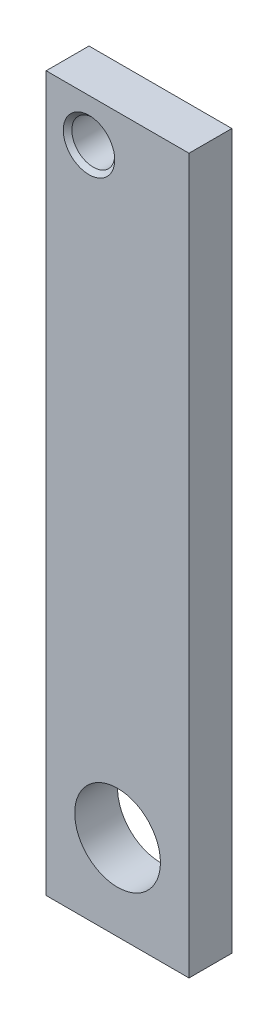
ISO-10303-21;
HEADER;
FILE_DESCRIPTION(('STEP AP214'),'2;1');
FILE_NAME('part.step','',(''),(''),'','','');
FILE_SCHEMA(('AUTOMOTIVE_DESIGN { 1 0 10303 214 1 1 1 1 }'));
ENDSEC;
DATA;
#1=APPLICATION_CONTEXT('core data for automotive mechanical design processes');
#2=APPLICATION_PROTOCOL_DEFINITION('international standard','automotive_design',2000,#1);
#3=PRODUCT_CONTEXT('',#1,'mechanical');
#4=PRODUCT('Part','Part','',(#3));
#5=PRODUCT_RELATED_PRODUCT_CATEGORY('part','',(#4));
#6=PRODUCT_DEFINITION_FORMATION('','',#4);
#7=PRODUCT_DEFINITION_CONTEXT('part definition',#1,'design');
#8=PRODUCT_DEFINITION('design','',#6,#7);
#9=PRODUCT_DEFINITION_SHAPE('','',#8);
#10=(LENGTH_UNIT() NAMED_UNIT(*) SI_UNIT(.MILLI.,.METRE.));
#11=(NAMED_UNIT(*) PLANE_ANGLE_UNIT() SI_UNIT($,.RADIAN.));
#12=(NAMED_UNIT(*) SI_UNIT($,.STERADIAN.) SOLID_ANGLE_UNIT());
#13=UNCERTAINTY_MEASURE_WITH_UNIT(LENGTH_MEASURE(1.E-05),#10,'distance_accuracy_value','');
#14=(GEOMETRIC_REPRESENTATION_CONTEXT(3) GLOBAL_UNCERTAINTY_ASSIGNED_CONTEXT((#13)) GLOBAL_UNIT_ASSIGNED_CONTEXT((#10,
#11,#12)) REPRESENTATION_CONTEXT('',''));
#15=CARTESIAN_POINT('',(0.,0.,0.));
#16=DIRECTION('',(0.,0.,1.));
#17=DIRECTION('',(1.,0.,0.));
#18=AXIS2_PLACEMENT_3D('',#15,#16,#17);
#19=CARTESIAN_POINT('',(2.99999999999999,47.,-1.13686837721616E-10));
#20=DIRECTION('',(0.,0.,-1.));
#21=DIRECTION('',(-1.,0.,0.));
#22=AXIS2_PLACEMENT_3D('',#19,#20,#21);
#23=CONICAL_SURFACE('',#22,1.79999999993198,0.785398162544797);
#24=CARTESIAN_POINT('',(2.99999999999999,47.,-1.13686837721616E-10));
#25=DIRECTION('',(0.,0.,-1.));
#26=DIRECTION('',(-1.,0.,0.));
#27=AXIS2_PLACEMENT_3D('',#24,#25,#26);
#28=CIRCLE('',#27,1.79999999993198);
#29=CARTESIAN_POINT('',(1.20000000006802,47.,-1.13686837721616E-10));
#30=VERTEX_POINT('',#29);
#31=EDGE_CURVE('E20',#30,#30,#28,.T.);
#32=ORIENTED_EDGE('',*,*,#31,.T.);
#33=EDGE_LOOP('',(#32));
#34=FACE_BOUND('',#33,.T.);
#35=CARTESIAN_POINT('',(2.99999999999999,47.,0.3));
#36=DIRECTION('',(0.,0.,1.));
#37=DIRECTION('',(1.,0.,0.));
#38=AXIS2_PLACEMENT_3D('',#35,#36,#37);
#39=CIRCLE('',#38,1.5);
#40=CARTESIAN_POINT('',(4.49999999999999,47.,0.3));
#41=VERTEX_POINT('',#40);
#42=EDGE_CURVE('E75',#41,#41,#39,.T.);
#43=ORIENTED_EDGE('',*,*,#42,.T.);
#44=EDGE_LOOP('',(#43));
#45=FACE_BOUND('',#44,.T.);
#46=ADVANCED_FACE('F17',(#34,#45),#23,.F.);
#47=CARTESIAN_POINT('',(5.,25.,0.));
#48=DIRECTION('',(0.,0.,1.));
#49=DIRECTION('',(1.,0.,0.));
#50=AXIS2_PLACEMENT_3D('',#47,#48,#49);
#51=PLANE('',#50);
#52=ORIENTED_EDGE('',*,*,#31,.F.);
#53=EDGE_LOOP('',(#52));
#54=FACE_BOUND('',#53,.T.);
#55=CARTESIAN_POINT('',(5.,6.,0.));
#56=DIRECTION('',(0.,0.,1.));
#57=DIRECTION('',(1.,0.,0.));
#58=AXIS2_PLACEMENT_3D('',#55,#56,#57);
#59=CIRCLE('',#58,3.);
#60=CARTESIAN_POINT('',(8.,6.,0.));
#61=VERTEX_POINT('',#60);
#62=EDGE_CURVE('E99',#61,#61,#59,.T.);
#63=ORIENTED_EDGE('',*,*,#62,.T.);
#64=EDGE_LOOP('',(#63));
#65=FACE_BOUND('',#64,.T.);
#66=DIRECTION('',(0.,1.,0.));
#67=VECTOR('',#66,1.);
#68=CARTESIAN_POINT('',(0.,0.,0.));
#69=LINE('',#68,#67);
#70=CARTESIAN_POINT('',(0.,50.,0.));
#71=VERTEX_POINT('',#70);
#72=CARTESIAN_POINT('',(0.,0.,0.));
#73=VERTEX_POINT('',#72);
#74=EDGE_CURVE('E65',#71,#73,#69,.F.);
#75=ORIENTED_EDGE('',*,*,#74,.F.);
#76=DIRECTION('',(1.,0.,0.));
#77=VECTOR('',#76,1.);
#78=CARTESIAN_POINT('',(0.,50.,0.));
#79=LINE('',#78,#77);
#80=CARTESIAN_POINT('',(10.,50.,0.));
#81=VERTEX_POINT('',#80);
#82=EDGE_CURVE('E109',#81,#71,#79,.F.);
#83=ORIENTED_EDGE('',*,*,#82,.F.);
#84=DIRECTION('',(0.,1.,0.));
#85=VECTOR('',#84,1.);
#86=CARTESIAN_POINT('',(10.,50.,0.));
#87=LINE('',#86,#85);
#88=CARTESIAN_POINT('',(10.,0.,0.));
#89=VERTEX_POINT('',#88);
#90=EDGE_CURVE('E78',#89,#81,#87,.T.);
#91=ORIENTED_EDGE('',*,*,#90,.F.);
#92=DIRECTION('',(1.,0.,0.));
#93=VECTOR('',#92,1.);
#94=CARTESIAN_POINT('',(10.,0.,0.));
#95=LINE('',#94,#93);
#96=EDGE_CURVE('E59',#73,#89,#95,.T.);
#97=ORIENTED_EDGE('',*,*,#96,.F.);
#98=EDGE_LOOP('',(#75,#83,#91,#97));
#99=FACE_BOUND('',#98,.T.);
#100=ADVANCED_FACE('F77',(#54,#65,#99),#51,.F.);
#101=CARTESIAN_POINT('',(2.99999999999999,47.,-1.));
#102=DIRECTION('',(0.,0.,1.));
#103=DIRECTION('',(1.,0.,0.));
#104=AXIS2_PLACEMENT_3D('',#101,#102,#103);
#105=CYLINDRICAL_SURFACE('',#104,1.5);
#106=ORIENTED_EDGE('',*,*,#42,.F.);
#107=EDGE_LOOP('',(#106));
#108=FACE_BOUND('',#107,.T.);
#109=CARTESIAN_POINT('',(2.99999999999999,47.,2.69999999983384));
#110=DIRECTION('',(0.,0.,1.));
#111=DIRECTION('',(-1.,0.,0.));
#112=AXIS2_PLACEMENT_3D('',#109,#110,#111);
#113=CIRCLE('',#112,1.50000000009231);
#114=CARTESIAN_POINT('',(1.49999999990769,47.,2.69999999983384));
#115=VERTEX_POINT('',#114);
#116=EDGE_CURVE('E102',#115,#115,#113,.T.);
#117=ORIENTED_EDGE('',*,*,#116,.T.);
#118=EDGE_LOOP('',(#117));
#119=FACE_BOUND('',#118,.T.);
#120=ADVANCED_FACE('F159',(#108,#119),#105,.F.);
#121=CARTESIAN_POINT('',(0.,0.,0.));
#122=DIRECTION('',(-1.,0.,0.));
#123=DIRECTION('',(0.,0.,1.));
#124=AXIS2_PLACEMENT_3D('',#121,#122,#123);
#125=PLANE('',#124);
#126=ORIENTED_EDGE('',*,*,#74,.T.);
#127=DIRECTION('',(0.,0.,-1.));
#128=VECTOR('',#127,1.);
#129=CARTESIAN_POINT('',(0.,0.,0.));
#130=LINE('',#129,#128);
#131=CARTESIAN_POINT('',(0.,0.,3.));
#132=VERTEX_POINT('',#131);
#133=EDGE_CURVE('E67',#132,#73,#130,.T.);
#134=ORIENTED_EDGE('',*,*,#133,.F.);
#135=DIRECTION('',(0.,1.,0.));
#136=VECTOR('',#135,1.);
#137=CARTESIAN_POINT('',(0.,25.,3.));
#138=LINE('',#137,#136);
#139=CARTESIAN_POINT('',(0.,50.,3.));
#140=VERTEX_POINT('',#139);
#141=EDGE_CURVE('E107',#140,#132,#138,.F.);
#142=ORIENTED_EDGE('',*,*,#141,.F.);
#143=DIRECTION('',(0.,0.,1.));
#144=VECTOR('',#143,1.);
#145=CARTESIAN_POINT('',(0.,50.,0.));
#146=LINE('',#145,#144);
#147=EDGE_CURVE('E70',#71,#140,#146,.T.);
#148=ORIENTED_EDGE('',*,*,#147,.F.);
#149=EDGE_LOOP('',(#126,#134,#142,#148));
#150=FACE_BOUND('',#149,.T.);
#151=ADVANCED_FACE('F66',(#150),#125,.T.);
#152=CARTESIAN_POINT('',(10.,0.,0.));
#153=DIRECTION('',(0.,-1.,0.));
#154=DIRECTION('',(0.,0.,-1.));
#155=AXIS2_PLACEMENT_3D('',#152,#153,#154);
#156=PLANE('',#155);
#157=ORIENTED_EDGE('',*,*,#96,.T.);
#158=DIRECTION('',(0.,0.,-1.));
#159=VECTOR('',#158,1.);
#160=CARTESIAN_POINT('',(10.,0.,0.));
#161=LINE('',#160,#159);
#162=CARTESIAN_POINT('',(10.,0.,3.));
#163=VERTEX_POINT('',#162);
#164=EDGE_CURVE('E81',#163,#89,#161,.T.);
#165=ORIENTED_EDGE('',*,*,#164,.F.);
#166=DIRECTION('',(1.,0.,0.));
#167=VECTOR('',#166,1.);
#168=CARTESIAN_POINT('',(5.,0.,3.));
#169=LINE('',#168,#167);
#170=EDGE_CURVE('E85',#132,#163,#169,.T.);
#171=ORIENTED_EDGE('',*,*,#170,.F.);
#172=ORIENTED_EDGE('',*,*,#133,.T.);
#173=EDGE_LOOP('',(#157,#165,#171,#172));
#174=FACE_BOUND('',#173,.T.);
#175=ADVANCED_FACE('F83',(#174),#156,.T.);
#176=CARTESIAN_POINT('',(10.,50.,0.));
#177=DIRECTION('',(1.,0.,0.));
#178=DIRECTION('',(0.,0.,-1.));
#179=AXIS2_PLACEMENT_3D('',#176,#177,#178);
#180=PLANE('',#179);
#181=ORIENTED_EDGE('',*,*,#90,.T.);
#182=DIRECTION('',(0.,0.,1.));
#183=VECTOR('',#182,1.);
#184=CARTESIAN_POINT('',(10.,50.,0.));
#185=LINE('',#184,#183);
#186=CARTESIAN_POINT('',(10.,50.,3.));
#187=VERTEX_POINT('',#186);
#188=EDGE_CURVE('E35',#187,#81,#185,.F.);
#189=ORIENTED_EDGE('',*,*,#188,.F.);
#190=DIRECTION('',(0.,1.,0.));
#191=VECTOR('',#190,1.);
#192=CARTESIAN_POINT('',(10.,25.,3.));
#193=LINE('',#192,#191);
#194=EDGE_CURVE('E122',#163,#187,#193,.T.);
#195=ORIENTED_EDGE('',*,*,#194,.F.);
#196=ORIENTED_EDGE('',*,*,#164,.T.);
#197=EDGE_LOOP('',(#181,#189,#195,#196));
#198=FACE_BOUND('',#197,.T.);
#199=ADVANCED_FACE('F120',(#198),#180,.T.);
#200=CARTESIAN_POINT('',(0.,50.,0.));
#201=DIRECTION('',(0.,1.,0.));
#202=DIRECTION('',(0.,0.,1.));
#203=AXIS2_PLACEMENT_3D('',#200,#201,#202);
#204=PLANE('',#203);
#205=ORIENTED_EDGE('',*,*,#82,.T.);
#206=ORIENTED_EDGE('',*,*,#147,.T.);
#207=DIRECTION('',(1.,0.,0.));
#208=VECTOR('',#207,1.);
#209=CARTESIAN_POINT('',(5.,50.,3.));
#210=LINE('',#209,#208);
#211=EDGE_CURVE('E98',#187,#140,#210,.F.);
#212=ORIENTED_EDGE('',*,*,#211,.F.);
#213=ORIENTED_EDGE('',*,*,#188,.T.);
#214=EDGE_LOOP('',(#205,#206,#212,#213));
#215=FACE_BOUND('',#214,.T.);
#216=ADVANCED_FACE('F131',(#215),#204,.T.);
#217=CARTESIAN_POINT('',(5.,6.,-1.));
#218=DIRECTION('',(0.,0.,1.));
#219=DIRECTION('',(1.,0.,0.));
#220=AXIS2_PLACEMENT_3D('',#217,#218,#219);
#221=CYLINDRICAL_SURFACE('',#220,3.);
#222=CARTESIAN_POINT('',(5.,6.,3.));
#223=DIRECTION('',(0.,0.,1.));
#224=DIRECTION('',(1.,0.,0.));
#225=AXIS2_PLACEMENT_3D('',#222,#223,#224);
#226=CIRCLE('',#225,3.);
#227=CARTESIAN_POINT('',(8.,6.,3.));
#228=VERTEX_POINT('',#227);
#229=EDGE_CURVE('E26',#228,#228,#226,.F.);
#230=ORIENTED_EDGE('',*,*,#229,.F.);
#231=EDGE_LOOP('',(#230));
#232=FACE_BOUND('',#231,.T.);
#233=ORIENTED_EDGE('',*,*,#62,.F.);
#234=EDGE_LOOP('',(#233));
#235=FACE_BOUND('',#234,.T.);
#236=ADVANCED_FACE('F133',(#232,#235),#221,.F.);
#237=CARTESIAN_POINT('',(2.99999999999999,47.,3.00000000004275));
#238=DIRECTION('',(0.,0.,1.));
#239=DIRECTION('',(0.,-1.,0.));
#240=AXIS2_PLACEMENT_3D('',#237,#238,#239);
#241=CONICAL_SURFACE('',#240,1.79999999973278,0.785398162544797);
#242=CARTESIAN_POINT('',(2.99999999999999,47.,3.00000000015643));
#243=DIRECTION('',(0.,0.,1.));
#244=DIRECTION('',(0.,-1.,0.));
#245=AXIS2_PLACEMENT_3D('',#242,#243,#244);
#246=CIRCLE('',#245,1.79999999984647);
#247=CARTESIAN_POINT('',(2.99999999999999,45.2000000001535,3.00000000015643));
#248=VERTEX_POINT('',#247);
#249=EDGE_CURVE('E11',#248,#248,#246,.F.);
#250=ORIENTED_EDGE('',*,*,#249,.F.);
#251=EDGE_LOOP('',(#250));
#252=FACE_BOUND('',#251,.T.);
#253=ORIENTED_EDGE('',*,*,#116,.F.);
#254=EDGE_LOOP('',(#253));
#255=FACE_BOUND('',#254,.T.);
#256=ADVANCED_FACE('F140',(#252,#255),#241,.F.);
#257=CARTESIAN_POINT('',(5.,25.,3.));
#258=DIRECTION('',(0.,0.,1.));
#259=DIRECTION('',(1.,0.,0.));
#260=AXIS2_PLACEMENT_3D('',#257,#258,#259);
#261=PLANE('',#260);
#262=ORIENTED_EDGE('',*,*,#249,.T.);
#263=EDGE_LOOP('',(#262));
#264=FACE_BOUND('',#263,.T.);
#265=ORIENTED_EDGE('',*,*,#229,.T.);
#266=EDGE_LOOP('',(#265));
#267=FACE_BOUND('',#266,.T.);
#268=ORIENTED_EDGE('',*,*,#194,.T.);
#269=ORIENTED_EDGE('',*,*,#211,.T.);
#270=ORIENTED_EDGE('',*,*,#141,.T.);
#271=ORIENTED_EDGE('',*,*,#170,.T.);
#272=EDGE_LOOP('',(#268,#269,#270,#271));
#273=FACE_BOUND('',#272,.T.);
#274=ADVANCED_FACE('F125',(#264,#267,#273),#261,.T.);
#275=CLOSED_SHELL('',(#46,#100,#120,#151,#175,#199,#216,#236,#256,#274));
#276=MANIFOLD_SOLID_BREP('B1',#275);
#277=ADVANCED_BREP_SHAPE_REPRESENTATION('',(#18,#276),#14);
#278=SHAPE_DEFINITION_REPRESENTATION(#9,#277);
ENDSEC;
END-ISO-10303-21;
